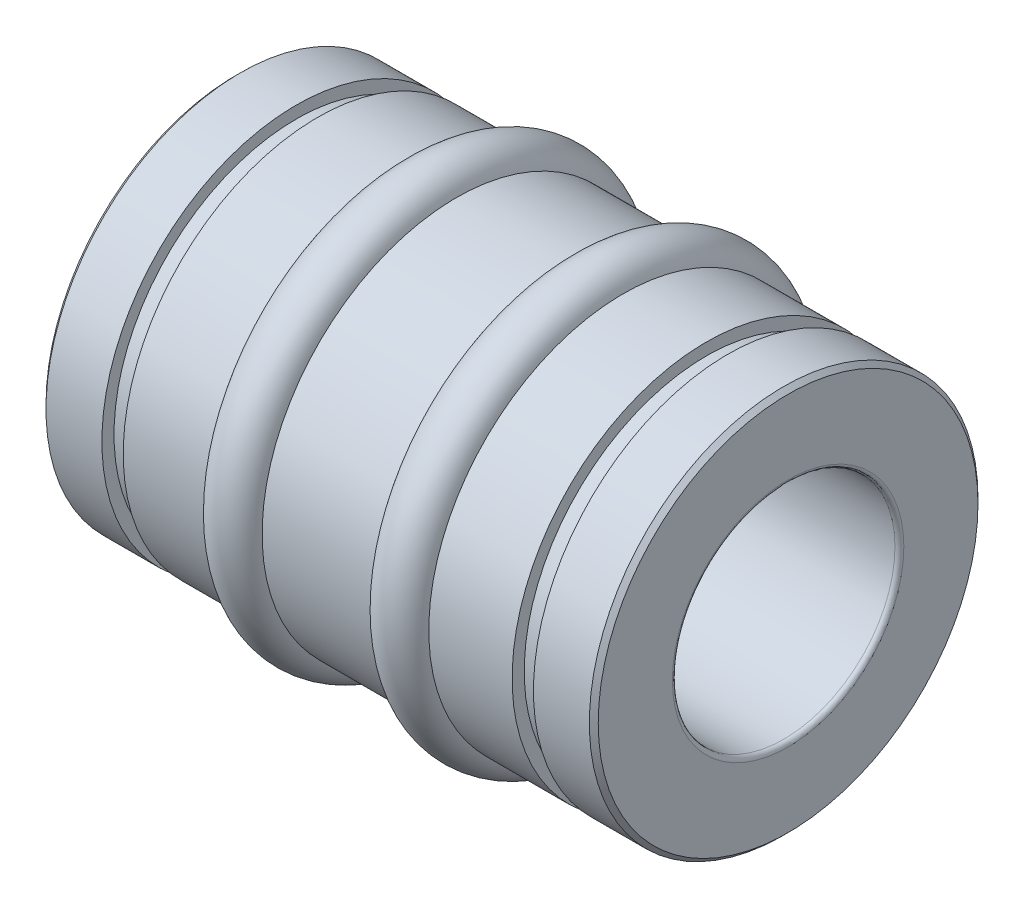
ISO-10303-21;
HEADER;
FILE_DESCRIPTION(('STEP AP214'),'2;1');
FILE_NAME('part.step','',(''),(''),'','','');
FILE_SCHEMA(('AUTOMOTIVE_DESIGN { 1 0 10303 214 1 1 1 1 }'));
ENDSEC;
DATA;
#1=APPLICATION_CONTEXT('core data for automotive mechanical design processes');
#2=APPLICATION_PROTOCOL_DEFINITION('international standard','automotive_design',2000,#1);
#3=PRODUCT_CONTEXT('',#1,'mechanical');
#4=PRODUCT('Part','Part','',(#3));
#5=PRODUCT_RELATED_PRODUCT_CATEGORY('part','',(#4));
#6=PRODUCT_DEFINITION_FORMATION('','',#4);
#7=PRODUCT_DEFINITION_CONTEXT('part definition',#1,'design');
#8=PRODUCT_DEFINITION('design','',#6,#7);
#9=PRODUCT_DEFINITION_SHAPE('','',#8);
#10=(LENGTH_UNIT() NAMED_UNIT(*) SI_UNIT(.MILLI.,.METRE.));
#11=(NAMED_UNIT(*) PLANE_ANGLE_UNIT() SI_UNIT($,.RADIAN.));
#12=(NAMED_UNIT(*) SI_UNIT($,.STERADIAN.) SOLID_ANGLE_UNIT());
#13=UNCERTAINTY_MEASURE_WITH_UNIT(LENGTH_MEASURE(1.E-05),#10,'distance_accuracy_value','');
#14=(GEOMETRIC_REPRESENTATION_CONTEXT(3) GLOBAL_UNCERTAINTY_ASSIGNED_CONTEXT((#13)) GLOBAL_UNIT_ASSIGNED_CONTEXT((#10,
#11,#12)) REPRESENTATION_CONTEXT('',''));
#15=CARTESIAN_POINT('',(0.,0.,0.));
#16=DIRECTION('',(0.,0.,1.));
#17=DIRECTION('',(1.,0.,0.));
#18=AXIS2_PLACEMENT_3D('',#15,#16,#17);
#19=CARTESIAN_POINT('',(4.7625,0.,0.));
#20=DIRECTION('',(-1.,0.,0.));
#21=DIRECTION('',(0.,0.,1.));
#22=AXIS2_PLACEMENT_3D('',#19,#20,#21);
#23=TOROIDAL_SURFACE('',#22,10.6299,1.5875);
#24=CARTESIAN_POINT('',(4.7625,0.,12.2174));
#25=VERTEX_POINT('',#24);
#26=VERTEX_LOOP('',#25);
#27=FACE_BOUND('',#26,.T.);
#28=ADVANCED_FACE('F39',(#27),#23,.T.);
#29=CLOSED_SHELL('',(#28));
#30=MANIFOLD_SOLID_BREP('B2',#29);
#31=CARTESIAN_POINT('',(-4.7625,0.,0.));
#32=DIRECTION('',(-1.,0.,0.));
#33=DIRECTION('',(0.,0.,1.));
#34=AXIS2_PLACEMENT_3D('',#31,#32,#33);
#35=TOROIDAL_SURFACE('',#34,10.6299,1.5875);
#36=CARTESIAN_POINT('',(-4.7625,0.,12.2174));
#37=VERTEX_POINT('',#36);
#38=VERTEX_LOOP('',#37);
#39=FACE_BOUND('',#38,.T.);
#40=ADVANCED_FACE('F58',(#39),#35,.T.);
#41=CLOSED_SHELL('',(#40));
#42=MANIFOLD_SOLID_BREP('B6',#41);
#43=CARTESIAN_POINT('',(-15.52575,0.,0.));
#44=DIRECTION('',(1.,0.,0.));
#45=DIRECTION('',(0.,0.,-1.));
#46=AXIS2_PLACEMENT_3D('',#43,#44,#45);
#47=CONICAL_SURFACE('',#46,11.10615,0.785398163397455);
#48=CARTESIAN_POINT('',(-15.77975,0.,0.));
#49=DIRECTION('',(1.,0.,0.));
#50=DIRECTION('',(0.,0.,-1.));
#51=AXIS2_PLACEMENT_3D('',#48,#49,#50);
#52=CIRCLE('',#51,10.85215);
#53=CARTESIAN_POINT('',(-15.77975,0.,-10.85215));
#54=VERTEX_POINT('',#53);
#55=EDGE_CURVE('E57',#54,#54,#52,.T.);
#56=ORIENTED_EDGE('',*,*,#55,.T.);
#57=EDGE_LOOP('',(#56));
#58=FACE_BOUND('',#57,.T.);
#59=CARTESIAN_POINT('',(-15.52575,0.,0.));
#60=DIRECTION('',(1.,0.,0.));
#61=DIRECTION('',(0.,0.,-1.));
#62=AXIS2_PLACEMENT_3D('',#59,#60,#61);
#63=CIRCLE('',#62,11.10615);
#64=CARTESIAN_POINT('',(-15.52575,0.,-11.10615));
#65=VERTEX_POINT('',#64);
#66=EDGE_CURVE('E146',#65,#65,#63,.T.);
#67=ORIENTED_EDGE('',*,*,#66,.F.);
#68=EDGE_LOOP('',(#67));
#69=FACE_BOUND('',#68,.T.);
#70=ADVANCED_FACE('F70',(#58,#69),#47,.T.);
#71=CARTESIAN_POINT('',(-15.77975,10.85215,0.));
#72=DIRECTION('',(-1.,0.,0.));
#73=DIRECTION('',(0.,0.,1.));
#74=AXIS2_PLACEMENT_3D('',#71,#72,#73);
#75=PLANE('',#74);
#76=CARTESIAN_POINT('',(-15.77975,0.,0.));
#77=DIRECTION('',(1.,0.,0.));
#78=DIRECTION('',(0.,0.,-1.));
#79=AXIS2_PLACEMENT_3D('',#76,#77,#78);
#80=CIRCLE('',#79,6.61416);
#81=CARTESIAN_POINT('',(-15.77975,0.,-6.61416));
#82=VERTEX_POINT('',#81);
#83=EDGE_CURVE('E76',#82,#82,#80,.T.);
#84=ORIENTED_EDGE('',*,*,#83,.T.);
#85=EDGE_LOOP('',(#84));
#86=FACE_BOUND('',#85,.T.);
#87=ORIENTED_EDGE('',*,*,#55,.F.);
#88=EDGE_LOOP('',(#87));
#89=FACE_BOUND('',#88,.T.);
#90=ADVANCED_FACE('F154',(#86,#89),#75,.T.);
#91=CARTESIAN_POINT('',(-15.5257499999994,0.,0.));
#92=DIRECTION('',(1.,0.,0.));
#93=DIRECTION('',(0.,0.,-1.));
#94=AXIS2_PLACEMENT_3D('',#91,#92,#93);
#95=TOROIDAL_SURFACE('',#94,6.61416000000062,0.254000000000622);
#96=CARTESIAN_POINT('',(-15.52575,0.,0.));
#97=DIRECTION('',(1.,0.,0.));
#98=DIRECTION('',(0.,0.,-1.));
#99=AXIS2_PLACEMENT_3D('',#96,#97,#98);
#100=CIRCLE('',#99,6.36016);
#101=CARTESIAN_POINT('',(-15.52575,0.,-6.36016));
#102=VERTEX_POINT('',#101);
#103=EDGE_CURVE('E80',#102,#102,#100,.T.);
#104=ORIENTED_EDGE('',*,*,#103,.T.);
#105=EDGE_LOOP('',(#104));
#106=FACE_BOUND('',#105,.T.);
#107=ORIENTED_EDGE('',*,*,#83,.F.);
#108=EDGE_LOOP('',(#107));
#109=FACE_BOUND('',#108,.T.);
#110=ADVANCED_FACE('F158',(#106,#109),#95,.T.);
#111=CARTESIAN_POINT('',(15.77975,0.,0.));
#112=DIRECTION('',(1.,0.,0.));
#113=DIRECTION('',(0.,0.,-1.));
#114=AXIS2_PLACEMENT_3D('',#111,#112,#113);
#115=CYLINDRICAL_SURFACE('',#114,6.36016);
#116=CARTESIAN_POINT('',(15.52575,0.,0.));
#117=DIRECTION('',(1.,0.,0.));
#118=DIRECTION('',(0.,0.,-1.));
#119=AXIS2_PLACEMENT_3D('',#116,#117,#118);
#120=CIRCLE('',#119,6.36016);
#121=CARTESIAN_POINT('',(15.52575,0.,-6.36016));
#122=VERTEX_POINT('',#121);
#123=EDGE_CURVE('E84',#122,#122,#120,.T.);
#124=ORIENTED_EDGE('',*,*,#123,.T.);
#125=EDGE_LOOP('',(#124));
#126=FACE_BOUND('',#125,.T.);
#127=ORIENTED_EDGE('',*,*,#103,.F.);
#128=EDGE_LOOP('',(#127));
#129=FACE_BOUND('',#128,.T.);
#130=ADVANCED_FACE('F162',(#126,#129),#115,.F.);
#131=CARTESIAN_POINT('',(15.5257499999994,0.,0.));
#132=DIRECTION('',(1.,0.,0.));
#133=DIRECTION('',(0.,0.,-1.));
#134=AXIS2_PLACEMENT_3D('',#131,#132,#133);
#135=TOROIDAL_SURFACE('',#134,6.61416000000062,0.254000000000622);
#136=CARTESIAN_POINT('',(15.77975,0.,0.));
#137=DIRECTION('',(1.,0.,0.));
#138=DIRECTION('',(0.,0.,-1.));
#139=AXIS2_PLACEMENT_3D('',#136,#137,#138);
#140=CIRCLE('',#139,6.61416);
#141=CARTESIAN_POINT('',(15.77975,0.,-6.61416));
#142=VERTEX_POINT('',#141);
#143=EDGE_CURVE('E89',#142,#142,#140,.T.);
#144=ORIENTED_EDGE('',*,*,#143,.T.);
#145=EDGE_LOOP('',(#144));
#146=FACE_BOUND('',#145,.T.);
#147=ORIENTED_EDGE('',*,*,#123,.F.);
#148=EDGE_LOOP('',(#147));
#149=FACE_BOUND('',#148,.T.);
#150=ADVANCED_FACE('F169',(#146,#149),#135,.T.);
#151=CARTESIAN_POINT('',(15.77975,6.61416,0.));
#152=DIRECTION('',(1.,0.,0.));
#153=DIRECTION('',(0.,0.,-1.));
#154=AXIS2_PLACEMENT_3D('',#151,#152,#153);
#155=PLANE('',#154);
#156=CARTESIAN_POINT('',(15.77975,0.,0.));
#157=DIRECTION('',(1.,0.,0.));
#158=DIRECTION('',(0.,0.,-1.));
#159=AXIS2_PLACEMENT_3D('',#156,#157,#158);
#160=CIRCLE('',#159,10.85215);
#161=CARTESIAN_POINT('',(15.77975,0.,-10.85215));
#162=VERTEX_POINT('',#161);
#163=EDGE_CURVE('E92',#162,#162,#160,.T.);
#164=ORIENTED_EDGE('',*,*,#163,.T.);
#165=EDGE_LOOP('',(#164));
#166=FACE_BOUND('',#165,.T.);
#167=ORIENTED_EDGE('',*,*,#143,.F.);
#168=EDGE_LOOP('',(#167));
#169=FACE_BOUND('',#168,.T.);
#170=ADVANCED_FACE('F173',(#166,#169),#155,.T.);
#171=CARTESIAN_POINT('',(15.77975,0.,0.));
#172=DIRECTION('',(-1.,0.,0.));
#173=DIRECTION('',(0.,0.,1.));
#174=AXIS2_PLACEMENT_3D('',#171,#172,#173);
#175=CONICAL_SURFACE('',#174,10.85215,0.785398163397452);
#176=CARTESIAN_POINT('',(15.52575,0.,0.));
#177=DIRECTION('',(1.,0.,0.));
#178=DIRECTION('',(0.,0.,-1.));
#179=AXIS2_PLACEMENT_3D('',#176,#177,#178);
#180=CIRCLE('',#179,11.10615);
#181=CARTESIAN_POINT('',(15.52575,0.,-11.10615));
#182=VERTEX_POINT('',#181);
#183=EDGE_CURVE('E95',#182,#182,#180,.T.);
#184=ORIENTED_EDGE('',*,*,#183,.T.);
#185=EDGE_LOOP('',(#184));
#186=FACE_BOUND('',#185,.T.);
#187=ORIENTED_EDGE('',*,*,#163,.F.);
#188=EDGE_LOOP('',(#187));
#189=FACE_BOUND('',#188,.T.);
#190=ADVANCED_FACE('F177',(#186,#189),#175,.T.);
#191=CARTESIAN_POINT('',(15.77975,0.,0.));
#192=DIRECTION('',(1.,0.,0.));
#193=DIRECTION('',(0.,0.,-1.));
#194=AXIS2_PLACEMENT_3D('',#191,#192,#193);
#195=CYLINDRICAL_SURFACE('',#194,11.10615);
#196=CARTESIAN_POINT('',(12.3317,0.,0.));
#197=DIRECTION('',(1.,0.,0.));
#198=DIRECTION('',(0.,0.,-1.));
#199=AXIS2_PLACEMENT_3D('',#196,#197,#198);
#200=CIRCLE('',#199,11.10615);
#201=CARTESIAN_POINT('',(12.3317,0.,-11.10615));
#202=VERTEX_POINT('',#201);
#203=EDGE_CURVE('E98',#202,#202,#200,.T.);
#204=ORIENTED_EDGE('',*,*,#203,.T.);
#205=EDGE_LOOP('',(#204));
#206=FACE_BOUND('',#205,.T.);
#207=ORIENTED_EDGE('',*,*,#183,.F.);
#208=EDGE_LOOP('',(#207));
#209=FACE_BOUND('',#208,.T.);
#210=ADVANCED_FACE('F181',(#206,#209),#195,.T.);
#211=CARTESIAN_POINT('',(12.3317,11.10615,0.));
#212=DIRECTION('',(-1.,0.,0.));
#213=DIRECTION('',(0.,0.,1.));
#214=AXIS2_PLACEMENT_3D('',#211,#212,#213);
#215=PLANE('',#214);
#216=CARTESIAN_POINT('',(12.3317,0.,0.));
#217=DIRECTION('',(1.,0.,0.));
#218=DIRECTION('',(0.,0.,-1.));
#219=AXIS2_PLACEMENT_3D('',#216,#217,#218);
#220=CIRCLE('',#219,10.414);
#221=CARTESIAN_POINT('',(12.3317,0.,-10.414));
#222=VERTEX_POINT('',#221);
#223=EDGE_CURVE('E101',#222,#222,#220,.T.);
#224=ORIENTED_EDGE('',*,*,#223,.T.);
#225=EDGE_LOOP('',(#224));
#226=FACE_BOUND('',#225,.T.);
#227=ORIENTED_EDGE('',*,*,#203,.F.);
#228=EDGE_LOOP('',(#227));
#229=FACE_BOUND('',#228,.T.);
#230=ADVANCED_FACE('F185',(#226,#229),#215,.T.);
#231=CARTESIAN_POINT('',(15.77975,0.,0.));
#232=DIRECTION('',(1.,0.,0.));
#233=DIRECTION('',(0.,0.,-1.));
#234=AXIS2_PLACEMENT_3D('',#231,#232,#233);
#235=CYLINDRICAL_SURFACE('',#234,10.414);
#236=CARTESIAN_POINT('',(11.1125,0.,0.));
#237=DIRECTION('',(1.,0.,0.));
#238=DIRECTION('',(0.,0.,-1.));
#239=AXIS2_PLACEMENT_3D('',#236,#237,#238);
#240=CIRCLE('',#239,10.414);
#241=CARTESIAN_POINT('',(11.1125,0.,-10.414));
#242=VERTEX_POINT('',#241);
#243=EDGE_CURVE('E104',#242,#242,#240,.T.);
#244=ORIENTED_EDGE('',*,*,#243,.T.);
#245=EDGE_LOOP('',(#244));
#246=FACE_BOUND('',#245,.T.);
#247=ORIENTED_EDGE('',*,*,#223,.F.);
#248=EDGE_LOOP('',(#247));
#249=FACE_BOUND('',#248,.T.);
#250=ADVANCED_FACE('F189',(#246,#249),#235,.T.);
#251=CARTESIAN_POINT('',(11.1125,10.414,0.));
#252=DIRECTION('',(1.,0.,0.));
#253=DIRECTION('',(0.,0.,-1.));
#254=AXIS2_PLACEMENT_3D('',#251,#252,#253);
#255=PLANE('',#254);
#256=CARTESIAN_POINT('',(11.1125,0.,0.));
#257=DIRECTION('',(1.,0.,0.));
#258=DIRECTION('',(0.,0.,-1.));
#259=AXIS2_PLACEMENT_3D('',#256,#257,#258);
#260=CIRCLE('',#259,11.10615);
#261=CARTESIAN_POINT('',(11.1125,0.,-11.10615));
#262=VERTEX_POINT('',#261);
#263=EDGE_CURVE('E107',#262,#262,#260,.T.);
#264=ORIENTED_EDGE('',*,*,#263,.T.);
#265=EDGE_LOOP('',(#264));
#266=FACE_BOUND('',#265,.T.);
#267=ORIENTED_EDGE('',*,*,#243,.F.);
#268=EDGE_LOOP('',(#267));
#269=FACE_BOUND('',#268,.T.);
#270=ADVANCED_FACE('F193',(#266,#269),#255,.T.);
#271=CARTESIAN_POINT('',(15.77975,0.,0.));
#272=DIRECTION('',(1.,0.,0.));
#273=DIRECTION('',(0.,0.,-1.));
#274=AXIS2_PLACEMENT_3D('',#271,#272,#273);
#275=CYLINDRICAL_SURFACE('',#274,11.10615);
#276=CARTESIAN_POINT('',(6.35,0.,0.));
#277=DIRECTION('',(1.,0.,0.));
#278=DIRECTION('',(0.,0.,-1.));
#279=AXIS2_PLACEMENT_3D('',#276,#277,#278);
#280=CIRCLE('',#279,11.10615);
#281=CARTESIAN_POINT('',(6.35,0.,-11.10615));
#282=VERTEX_POINT('',#281);
#283=EDGE_CURVE('E110',#282,#282,#280,.T.);
#284=ORIENTED_EDGE('',*,*,#283,.T.);
#285=EDGE_LOOP('',(#284));
#286=FACE_BOUND('',#285,.T.);
#287=ORIENTED_EDGE('',*,*,#263,.F.);
#288=EDGE_LOOP('',(#287));
#289=FACE_BOUND('',#288,.T.);
#290=ADVANCED_FACE('F197',(#286,#289),#275,.T.);
#291=CARTESIAN_POINT('',(6.35,11.10615,0.));
#292=DIRECTION('',(-1.,0.,0.));
#293=DIRECTION('',(0.,0.,1.));
#294=AXIS2_PLACEMENT_3D('',#291,#292,#293);
#295=PLANE('',#294);
#296=CARTESIAN_POINT('',(6.35,0.,0.));
#297=DIRECTION('',(1.,0.,0.));
#298=DIRECTION('',(0.,0.,-1.));
#299=AXIS2_PLACEMENT_3D('',#296,#297,#298);
#300=CIRCLE('',#299,9.0424000000004);
#301=CARTESIAN_POINT('',(6.35,0.,-9.0424000000004));
#302=VERTEX_POINT('',#301);
#303=EDGE_CURVE('E113',#302,#302,#300,.T.);
#304=ORIENTED_EDGE('',*,*,#303,.T.);
#305=EDGE_LOOP('',(#304));
#306=FACE_BOUND('',#305,.T.);
#307=ORIENTED_EDGE('',*,*,#283,.F.);
#308=EDGE_LOOP('',(#307));
#309=FACE_BOUND('',#308,.T.);
#310=ADVANCED_FACE('F201',(#306,#309),#295,.T.);
#311=CARTESIAN_POINT('',(15.77975,0.,0.));
#312=DIRECTION('',(1.,0.,0.));
#313=DIRECTION('',(0.,0.,-1.));
#314=AXIS2_PLACEMENT_3D('',#311,#312,#313);
#315=CYLINDRICAL_SURFACE('',#314,9.0424000000004);
#316=ORIENTED_EDGE('',*,*,#303,.F.);
#317=EDGE_LOOP('',(#316));
#318=FACE_BOUND('',#317,.T.);
#319=CARTESIAN_POINT('',(3.175,0.,0.));
#320=DIRECTION('',(1.,0.,0.));
#321=DIRECTION('',(0.,0.,-1.));
#322=AXIS2_PLACEMENT_3D('',#319,#320,#321);
#323=CIRCLE('',#322,9.0424000000004);
#324=CARTESIAN_POINT('',(3.175,0.,-9.0424000000004));
#325=VERTEX_POINT('',#324);
#326=EDGE_CURVE('E116',#325,#325,#323,.T.);
#327=ORIENTED_EDGE('',*,*,#326,.T.);
#328=EDGE_LOOP('',(#327));
#329=FACE_BOUND('',#328,.T.);
#330=ADVANCED_FACE('F205',(#318,#329),#315,.T.);
#331=CARTESIAN_POINT('',(3.175,9.0424000000004,0.));
#332=DIRECTION('',(1.,0.,0.));
#333=DIRECTION('',(0.,0.,-1.));
#334=AXIS2_PLACEMENT_3D('',#331,#332,#333);
#335=PLANE('',#334);
#336=CARTESIAN_POINT('',(3.175,0.,0.));
#337=DIRECTION('',(1.,0.,0.));
#338=DIRECTION('',(0.,0.,-1.));
#339=AXIS2_PLACEMENT_3D('',#336,#337,#338);
#340=CIRCLE('',#339,11.10615);
#341=CARTESIAN_POINT('',(3.175,0.,-11.10615));
#342=VERTEX_POINT('',#341);
#343=EDGE_CURVE('E119',#342,#342,#340,.T.);
#344=ORIENTED_EDGE('',*,*,#343,.T.);
#345=EDGE_LOOP('',(#344));
#346=FACE_BOUND('',#345,.T.);
#347=ORIENTED_EDGE('',*,*,#326,.F.);
#348=EDGE_LOOP('',(#347));
#349=FACE_BOUND('',#348,.T.);
#350=ADVANCED_FACE('F209',(#346,#349),#335,.T.);
#351=CARTESIAN_POINT('',(15.77975,0.,0.));
#352=DIRECTION('',(1.,0.,0.));
#353=DIRECTION('',(0.,0.,-1.));
#354=AXIS2_PLACEMENT_3D('',#351,#352,#353);
#355=CYLINDRICAL_SURFACE('',#354,11.10615);
#356=CARTESIAN_POINT('',(-3.175,0.,0.));
#357=DIRECTION('',(1.,0.,0.));
#358=DIRECTION('',(0.,0.,-1.));
#359=AXIS2_PLACEMENT_3D('',#356,#357,#358);
#360=CIRCLE('',#359,11.10615);
#361=CARTESIAN_POINT('',(-3.175,0.,-11.10615));
#362=VERTEX_POINT('',#361);
#363=EDGE_CURVE('E122',#362,#362,#360,.T.);
#364=ORIENTED_EDGE('',*,*,#363,.T.);
#365=EDGE_LOOP('',(#364));
#366=FACE_BOUND('',#365,.T.);
#367=ORIENTED_EDGE('',*,*,#343,.F.);
#368=EDGE_LOOP('',(#367));
#369=FACE_BOUND('',#368,.T.);
#370=ADVANCED_FACE('F213',(#366,#369),#355,.T.);
#371=CARTESIAN_POINT('',(-3.175,11.10615,0.));
#372=DIRECTION('',(-1.,0.,0.));
#373=DIRECTION('',(0.,0.,1.));
#374=AXIS2_PLACEMENT_3D('',#371,#372,#373);
#375=PLANE('',#374);
#376=CARTESIAN_POINT('',(-3.175,0.,0.));
#377=DIRECTION('',(1.,0.,0.));
#378=DIRECTION('',(0.,0.,-1.));
#379=AXIS2_PLACEMENT_3D('',#376,#377,#378);
#380=CIRCLE('',#379,9.0424);
#381=CARTESIAN_POINT('',(-3.175,0.,-9.0424));
#382=VERTEX_POINT('',#381);
#383=EDGE_CURVE('E125',#382,#382,#380,.T.);
#384=ORIENTED_EDGE('',*,*,#383,.T.);
#385=EDGE_LOOP('',(#384));
#386=FACE_BOUND('',#385,.T.);
#387=ORIENTED_EDGE('',*,*,#363,.F.);
#388=EDGE_LOOP('',(#387));
#389=FACE_BOUND('',#388,.T.);
#390=ADVANCED_FACE('F217',(#386,#389),#375,.T.);
#391=CARTESIAN_POINT('',(15.77975,0.,0.));
#392=DIRECTION('',(1.,0.,0.));
#393=DIRECTION('',(0.,0.,-1.));
#394=AXIS2_PLACEMENT_3D('',#391,#392,#393);
#395=CYLINDRICAL_SURFACE('',#394,9.0424);
#396=ORIENTED_EDGE('',*,*,#383,.F.);
#397=EDGE_LOOP('',(#396));
#398=FACE_BOUND('',#397,.T.);
#399=CARTESIAN_POINT('',(-6.35,0.,0.));
#400=DIRECTION('',(1.,0.,0.));
#401=DIRECTION('',(0.,0.,-1.));
#402=AXIS2_PLACEMENT_3D('',#399,#400,#401);
#403=CIRCLE('',#402,9.0424);
#404=CARTESIAN_POINT('',(-6.35,0.,-9.0424));
#405=VERTEX_POINT('',#404);
#406=EDGE_CURVE('E128',#405,#405,#403,.T.);
#407=ORIENTED_EDGE('',*,*,#406,.T.);
#408=EDGE_LOOP('',(#407));
#409=FACE_BOUND('',#408,.T.);
#410=ADVANCED_FACE('F221',(#398,#409),#395,.T.);
#411=CARTESIAN_POINT('',(-6.35,9.0424,0.));
#412=DIRECTION('',(1.,0.,0.));
#413=DIRECTION('',(0.,0.,-1.));
#414=AXIS2_PLACEMENT_3D('',#411,#412,#413);
#415=PLANE('',#414);
#416=CARTESIAN_POINT('',(-6.35,0.,0.));
#417=DIRECTION('',(1.,0.,0.));
#418=DIRECTION('',(0.,0.,-1.));
#419=AXIS2_PLACEMENT_3D('',#416,#417,#418);
#420=CIRCLE('',#419,11.10615);
#421=CARTESIAN_POINT('',(-6.35,0.,-11.10615));
#422=VERTEX_POINT('',#421);
#423=EDGE_CURVE('E131',#422,#422,#420,.T.);
#424=ORIENTED_EDGE('',*,*,#423,.T.);
#425=EDGE_LOOP('',(#424));
#426=FACE_BOUND('',#425,.T.);
#427=ORIENTED_EDGE('',*,*,#406,.F.);
#428=EDGE_LOOP('',(#427));
#429=FACE_BOUND('',#428,.T.);
#430=ADVANCED_FACE('F225',(#426,#429),#415,.T.);
#431=CARTESIAN_POINT('',(15.77975,0.,0.));
#432=DIRECTION('',(1.,0.,0.));
#433=DIRECTION('',(0.,0.,-1.));
#434=AXIS2_PLACEMENT_3D('',#431,#432,#433);
#435=CYLINDRICAL_SURFACE('',#434,11.10615);
#436=CARTESIAN_POINT('',(-11.1125,0.,0.));
#437=DIRECTION('',(1.,0.,0.));
#438=DIRECTION('',(0.,0.,-1.));
#439=AXIS2_PLACEMENT_3D('',#436,#437,#438);
#440=CIRCLE('',#439,11.10615);
#441=CARTESIAN_POINT('',(-11.1125,0.,-11.10615));
#442=VERTEX_POINT('',#441);
#443=EDGE_CURVE('E134',#442,#442,#440,.T.);
#444=ORIENTED_EDGE('',*,*,#443,.T.);
#445=EDGE_LOOP('',(#444));
#446=FACE_BOUND('',#445,.T.);
#447=ORIENTED_EDGE('',*,*,#423,.F.);
#448=EDGE_LOOP('',(#447));
#449=FACE_BOUND('',#448,.T.);
#450=ADVANCED_FACE('F229',(#446,#449),#435,.T.);
#451=CARTESIAN_POINT('',(-11.1125,11.10615,0.));
#452=DIRECTION('',(-1.,0.,0.));
#453=DIRECTION('',(0.,0.,1.));
#454=AXIS2_PLACEMENT_3D('',#451,#452,#453);
#455=PLANE('',#454);
#456=CARTESIAN_POINT('',(-11.1125,0.,0.));
#457=DIRECTION('',(1.,0.,0.));
#458=DIRECTION('',(0.,0.,-1.));
#459=AXIS2_PLACEMENT_3D('',#456,#457,#458);
#460=CIRCLE('',#459,10.414);
#461=CARTESIAN_POINT('',(-11.1125,0.,-10.414));
#462=VERTEX_POINT('',#461);
#463=EDGE_CURVE('E137',#462,#462,#460,.T.);
#464=ORIENTED_EDGE('',*,*,#463,.T.);
#465=EDGE_LOOP('',(#464));
#466=FACE_BOUND('',#465,.T.);
#467=ORIENTED_EDGE('',*,*,#443,.F.);
#468=EDGE_LOOP('',(#467));
#469=FACE_BOUND('',#468,.T.);
#470=ADVANCED_FACE('F233',(#466,#469),#455,.T.);
#471=CARTESIAN_POINT('',(15.77975,0.,0.));
#472=DIRECTION('',(1.,0.,0.));
#473=DIRECTION('',(0.,0.,-1.));
#474=AXIS2_PLACEMENT_3D('',#471,#472,#473);
#475=CYLINDRICAL_SURFACE('',#474,10.414);
#476=CARTESIAN_POINT('',(-12.3317,0.,0.));
#477=DIRECTION('',(1.,0.,0.));
#478=DIRECTION('',(0.,0.,-1.));
#479=AXIS2_PLACEMENT_3D('',#476,#477,#478);
#480=CIRCLE('',#479,10.414);
#481=CARTESIAN_POINT('',(-12.3317,0.,-10.414));
#482=VERTEX_POINT('',#481);
#483=EDGE_CURVE('E140',#482,#482,#480,.T.);
#484=ORIENTED_EDGE('',*,*,#483,.T.);
#485=EDGE_LOOP('',(#484));
#486=FACE_BOUND('',#485,.T.);
#487=ORIENTED_EDGE('',*,*,#463,.F.);
#488=EDGE_LOOP('',(#487));
#489=FACE_BOUND('',#488,.T.);
#490=ADVANCED_FACE('F237',(#486,#489),#475,.T.);
#491=CARTESIAN_POINT('',(-12.3317,10.414,0.));
#492=DIRECTION('',(1.,0.,0.));
#493=DIRECTION('',(0.,0.,-1.));
#494=AXIS2_PLACEMENT_3D('',#491,#492,#493);
#495=PLANE('',#494);
#496=CARTESIAN_POINT('',(-12.3317,0.,0.));
#497=DIRECTION('',(1.,0.,0.));
#498=DIRECTION('',(0.,0.,-1.));
#499=AXIS2_PLACEMENT_3D('',#496,#497,#498);
#500=CIRCLE('',#499,11.10615);
#501=CARTESIAN_POINT('',(-12.3317,0.,-11.10615));
#502=VERTEX_POINT('',#501);
#503=EDGE_CURVE('E143',#502,#502,#500,.T.);
#504=ORIENTED_EDGE('',*,*,#503,.T.);
#505=EDGE_LOOP('',(#504));
#506=FACE_BOUND('',#505,.T.);
#507=ORIENTED_EDGE('',*,*,#483,.F.);
#508=EDGE_LOOP('',(#507));
#509=FACE_BOUND('',#508,.T.);
#510=ADVANCED_FACE('F241',(#506,#509),#495,.T.);
#511=CARTESIAN_POINT('',(15.77975,0.,0.));
#512=DIRECTION('',(1.,0.,0.));
#513=DIRECTION('',(0.,0.,-1.));
#514=AXIS2_PLACEMENT_3D('',#511,#512,#513);
#515=CYLINDRICAL_SURFACE('',#514,11.10615);
#516=ORIENTED_EDGE('',*,*,#66,.T.);
#517=EDGE_LOOP('',(#516));
#518=FACE_BOUND('',#517,.T.);
#519=ORIENTED_EDGE('',*,*,#503,.F.);
#520=EDGE_LOOP('',(#519));
#521=FACE_BOUND('',#520,.T.);
#522=ADVANCED_FACE('F150',(#518,#521),#515,.T.);
#523=CLOSED_SHELL('',(#70,#90,#110,#130,#150,#170,#190,#210,#230,#250,#270,#290,#310,#330,#350,
#370,#390,#410,#430,#450,#470,#490,#510,#522));
#524=MANIFOLD_SOLID_BREP('B35',#523);
#525=ADVANCED_BREP_SHAPE_REPRESENTATION('',(#18,#30,#42,#524),#14);
#526=SHAPE_DEFINITION_REPRESENTATION(#9,#525);
ENDSEC;
END-ISO-10303-21;
